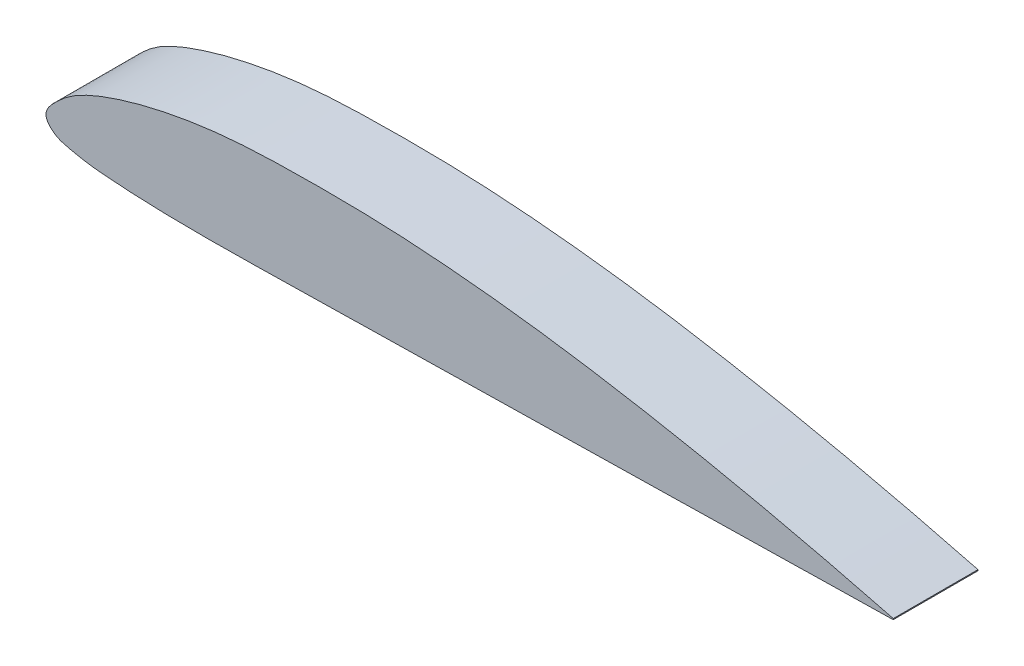
ISO-10303-21;
HEADER;
FILE_DESCRIPTION(('STEP AP214'),'2;1');
FILE_NAME('part.step','',(''),(''),'','','');
FILE_SCHEMA(('AUTOMOTIVE_DESIGN { 1 0 10303 214 1 1 1 1 }'));
ENDSEC;
DATA;
#1=APPLICATION_CONTEXT('core data for automotive mechanical design processes');
#2=APPLICATION_PROTOCOL_DEFINITION('international standard','automotive_design',2000,#1);
#3=PRODUCT_CONTEXT('',#1,'mechanical');
#4=PRODUCT('Part','Part','',(#3));
#5=PRODUCT_RELATED_PRODUCT_CATEGORY('part','',(#4));
#6=PRODUCT_DEFINITION_FORMATION('','',#4);
#7=PRODUCT_DEFINITION_CONTEXT('part definition',#1,'design');
#8=PRODUCT_DEFINITION('design','',#6,#7);
#9=PRODUCT_DEFINITION_SHAPE('','',#8);
#10=(LENGTH_UNIT() NAMED_UNIT(*) SI_UNIT(.MILLI.,.METRE.));
#11=(NAMED_UNIT(*) PLANE_ANGLE_UNIT() SI_UNIT($,.RADIAN.));
#12=(NAMED_UNIT(*) SI_UNIT($,.STERADIAN.) SOLID_ANGLE_UNIT());
#13=UNCERTAINTY_MEASURE_WITH_UNIT(LENGTH_MEASURE(1.E-05),#10,'distance_accuracy_value','');
#14=(GEOMETRIC_REPRESENTATION_CONTEXT(3) GLOBAL_UNCERTAINTY_ASSIGNED_CONTEXT((#13)) GLOBAL_UNIT_ASSIGNED_CONTEXT((#10,
#11,#12)) REPRESENTATION_CONTEXT('',''));
#15=CARTESIAN_POINT('',(0.,0.,0.));
#16=DIRECTION('',(0.,0.,1.));
#17=DIRECTION('',(1.,0.,0.));
#18=AXIS2_PLACEMENT_3D('',#15,#16,#17);
#19=CARTESIAN_POINT('',(36.0244116229008,8.83389162209838,2.54));
#20=CARTESIAN_POINT('',(35.9401103880112,8.85544135572493,2.54));
#21=CARTESIAN_POINT('',(35.7715192547382,8.89853792505262,2.54));
#22=CARTESIAN_POINT('',(35.518615006872,8.96301180523324,2.54));
#23=CARTESIAN_POINT('',(35.265722853527,9.02726621860555,2.54));
#24=CARTESIAN_POINT('',(34.9285911205995,9.11227201238616,2.54));
#25=CARTESIAN_POINT('',(34.5071720053478,9.21707830359588,2.54));
#26=CARTESIAN_POINT('',(34.0012212999093,9.33999750117864,2.54));
#27=CARTESIAN_POINT('',(33.495215113899,9.46021481063174,2.54));
#28=CARTESIAN_POINT('',(32.9891990580677,9.57798313604354,2.54));
#29=CARTESIAN_POINT('',(32.4831313298856,9.69313577451666,2.54));
#30=CARTESIAN_POINT('',(31.9770268692627,9.80565387508404,2.54));
#31=CARTESIAN_POINT('',(31.4708528284104,9.91532430479675,2.54));
#32=CARTESIAN_POINT('',(30.9646538021946,10.0222690879351,2.54));
#33=CARTESIAN_POINT('',(30.4583759880928,10.1261934680355,2.54));
#34=CARTESIAN_POINT('',(29.9520678768009,10.227262376128,2.54));
#35=CARTESIAN_POINT('',(29.445684760486,10.3252438014009,2.54));
#36=CARTESIAN_POINT('',(28.9392672339054,10.4203069636247,2.54));
#37=CARTESIAN_POINT('',(28.4327892507069,10.5122948482318,2.54));
#38=CARTESIAN_POINT('',(27.9262702264024,10.6012165317799,2.54));
#39=CARTESIAN_POINT('',(27.4197056165849,10.6868790369494,2.54));
#40=CARTESIAN_POINT('',(26.9130589301014,10.7688301993306,2.54));
#41=CARTESIAN_POINT('',(26.4063560544678,10.8469530575221,2.54));
#42=CARTESIAN_POINT('',(25.8995614646011,10.9207869329597,2.54));
#43=CARTESIAN_POINT('',(25.2240549737191,11.0132504332984,2.54));
#44=CARTESIAN_POINT('',(24.5480141453919,11.0966445839144,2.54));
#45=CARTESIAN_POINT('',(23.8715459592572,11.1709083694092,2.54));
#46=CARTESIAN_POINT('',(23.3643430876918,11.2220189284426,2.54));
#47=CARTESIAN_POINT('',(22.8570658538505,11.2685217552309,2.54));
#48=CARTESIAN_POINT('',(22.1807821024889,11.3239820158418,2.54));
#49=CARTESIAN_POINT('',(21.5040554671134,11.3687237650845,2.54));
#50=CARTESIAN_POINT('',(20.8269796291316,11.4011454832613,2.54));
#51=CARTESIAN_POINT('',(20.3191679010904,11.4188321498629,2.54));
#52=CARTESIAN_POINT('',(19.8112546343039,11.4303145037513,2.54));
#53=CARTESIAN_POINT('',(19.3032501941174,11.4360515627545,2.54));
#54=CARTESIAN_POINT('',(18.7951631818029,11.4366841932682,2.54));
#55=CARTESIAN_POINT('',(18.2870012331172,11.4325442362608,2.54));
#56=CARTESIAN_POINT('',(17.778727324565,11.4245596873459,2.54));
#57=CARTESIAN_POINT('',(17.2702969651732,11.4105092351683,2.54));
#58=CARTESIAN_POINT('',(16.7616525002768,11.38797297823,2.54));
#59=CARTESIAN_POINT('',(16.2527374575186,11.3543481285077,2.54));
#60=CARTESIAN_POINT('',(15.7434861326676,11.3071832299665,2.54));
#61=CARTESIAN_POINT('',(15.2340224622295,11.2435995242716,2.54));
#62=CARTESIAN_POINT('',(14.7243423357386,11.163441883017,2.54));
#63=CARTESIAN_POINT('',(14.2142430503494,11.0673449348983,2.54));
#64=CARTESIAN_POINT('',(13.7035353889346,10.954250255143,2.54));
#65=CARTESIAN_POINT('',(13.1922195491395,10.8207133030235,2.54));
#66=CARTESIAN_POINT('',(12.6805448892658,10.6623372005084,2.54));
#67=CARTESIAN_POINT('',(12.254293529233,10.5099508609272,2.54));
#68=CARTESIAN_POINT('',(11.9141780112103,10.3655240801579,2.54));
#69=CARTESIAN_POINT('',(11.6561311894015,10.2390552515866,2.54));
#70=CARTESIAN_POINT('',(11.3953528397534,10.0879907717887,2.54));
#71=CARTESIAN_POINT('',(11.1539460257398,9.91061546354276,2.54));
#72=CARTESIAN_POINT('',(10.9720219426564,9.74146138689633,2.54));
#73=CARTESIAN_POINT('',(10.8330332124092,9.60537746654981,2.54));
#74=CARTESIAN_POINT('',(10.7445376455335,9.50566108582094,2.54));
#75=CARTESIAN_POINT('',(10.6859853648473,9.41953364628471,2.54));
#76=CARTESIAN_POINT('',(10.6570923509584,9.36294809061483,2.54));
#77=CARTESIAN_POINT('',(10.6384138153028,9.31408884330308,2.54));
#78=CARTESIAN_POINT('',(10.6210420494952,9.24332733901724,2.54));
#79=CARTESIAN_POINT('',(10.6279573030614,9.16925767775213,2.54));
#80=CARTESIAN_POINT('',(10.6525587370296,9.10445971673368,2.54));
#81=CARTESIAN_POINT('',(10.6793031516612,9.05280607795355,2.54));
#82=CARTESIAN_POINT('',(10.7341260264743,8.97723066134646,2.54));
#83=CARTESIAN_POINT('',(10.8183282952831,8.89667826673253,2.54));
#84=CARTESIAN_POINT('',(10.9502329427269,8.80400166544255,2.54));
#85=CARTESIAN_POINT('',(11.138372059504,8.72751354050775,2.54));
#86=CARTESIAN_POINT('',(11.3791531730066,8.67461308456474,2.54));
#87=CARTESIAN_POINT('',(11.6320536854982,8.61971887990225,2.54));
#88=CARTESIAN_POINT('',(11.8855210763617,8.57649699943447,2.54));
#89=CARTESIAN_POINT('',(12.2235502806181,8.53467734057742,2.54));
#90=CARTESIAN_POINT('',(12.6468620584357,8.50292972580234,2.54));
#91=CARTESIAN_POINT('',(13.1543995885915,8.46993345903285,2.54));
#92=CARTESIAN_POINT('',(13.662167573359,8.44656358856411,2.54));
#93=CARTESIAN_POINT('',(14.1700243566949,8.43082011750246,2.54));
#94=CARTESIAN_POINT('',(14.6779821990608,8.42174442539335,2.54));
#95=CARTESIAN_POINT('',(15.1860186256667,8.41830510571906,2.54));
#96=CARTESIAN_POINT('',(15.8635380028525,8.41967575660222,2.54));
#97=CARTESIAN_POINT('',(16.5411068976195,8.42798348666894,2.54));
#98=CARTESIAN_POINT('',(17.2186952368535,8.44011473495321,2.54));
#99=CARTESIAN_POINT('',(17.7269381583901,8.45030349452697,2.54));
#100=CARTESIAN_POINT('',(18.2351874296081,8.46092623984198,2.54));
#101=CARTESIAN_POINT('',(18.7434422150139,8.47116130068692,2.54));
#102=CARTESIAN_POINT('',(19.2516951707655,8.48099044831205,2.54));
#103=CARTESIAN_POINT('',(19.7599423117282,8.49069824096843,2.54));
#104=CARTESIAN_POINT('',(20.2681893646366,8.5002305878808,2.54));
#105=CARTESIAN_POINT('',(20.7764349500581,8.50982429031724,2.54));
#106=CARTESIAN_POINT('',(21.2846811378214,8.51950024136772,2.54));
#107=CARTESIAN_POINT('',(21.7929288388174,8.52924286913881,2.54));
#108=CARTESIAN_POINT('',(22.301176314642,8.53909364228895,2.54));
#109=CARTESIAN_POINT('',(22.8094258500054,8.54890218413859,2.54));
#110=CARTESIAN_POINT('',(23.3176742067309,8.55877163737149,2.54));
#111=CARTESIAN_POINT('',(23.8259232033712,8.56859196270717,2.54));
#112=CARTESIAN_POINT('',(24.334171588868,8.57839557797308,2.54));
#113=CARTESIAN_POINT('',(25.1812521552734,8.59467428180392,2.54));
#114=CARTESIAN_POINT('',(26.0283318895856,8.61098006099189,2.54));
#115=CARTESIAN_POINT('',(27.0448288447809,8.63051311381692,2.54));
#116=CARTESIAN_POINT('',(27.7224919942926,8.64362313909416,2.54));
#117=CARTESIAN_POINT('',(28.4001574799229,8.65662799377411,2.54));
#118=CARTESIAN_POINT('',(28.9084048389626,8.66645260420005,2.54));
#119=CARTESIAN_POINT('',(29.4166539482277,8.67620246805011,2.54));
#120=CARTESIAN_POINT('',(29.9249012877847,8.68602809016648,2.54));
#121=CARTESIAN_POINT('',(30.4331504022704,8.69577768292732,2.54));
#122=CARTESIAN_POINT('',(30.941397740428,8.70560337771099,2.54));
#123=CARTESIAN_POINT('',(31.4496468552907,8.71535295089204,2.54));
#124=CARTESIAN_POINT('',(31.9578941933394,8.72517865132761,2.54));
#125=CARTESIAN_POINT('',(32.4661433082605,8.73492822148093,2.54));
#126=CARTESIAN_POINT('',(32.9743906461848,8.74475392837555,2.54));
#127=CARTESIAN_POINT('',(33.4826397615452,8.75450347572038,2.54));
#128=CARTESIAN_POINT('',(33.9908870978363,8.76432926738997,2.54));
#129=CARTESIAN_POINT('',(34.4991362192905,8.77407849844366,2.54));
#130=CARTESIAN_POINT('',(34.9226756990267,8.78226764282826,2.54));
#131=CARTESIAN_POINT('',(35.2615081360034,8.78877788339691,2.54));
#132=CARTESIAN_POINT('',(35.5156320723571,8.79366877968042,2.54));
#133=CARTESIAN_POINT('',(35.7697565575686,8.79854733862278,2.54));
#134=CARTESIAN_POINT('',(35.9391724556521,8.80182714861004,2.54));
#135=CARTESIAN_POINT('',(36.0238805601348,8.80346705661293,2.54));
#136=B_SPLINE_CURVE_WITH_KNOTS('',3,(#19,#20,#21,#22,#23,#24,#25,#26,#27,#28,#29,#30,#31,#32,
#33,#34,#35,#36,#37,#38,#39,#40,#41,#42,#43,#44,#45,#46,#47,#48,#49,#50,#51,#52,#53,#54,#55,#56,
#57,#58,#59,#60,#61,#62,#63,#64,#65,#66,#67,#68,#69,#70,#71,#72,#73,#74,#75,#76,#77,#78,#79,#80,
#81,#82,#83,#84,#85,#86,#87,#88,#89,#90,#91,#92,#93,#94,#95,#96,#97,#98,#99,#100,#101,#102,#103,
#104,#105,#106,#107,#108,#109,#110,#111,#112,#113,#114,#115,#116,#117,#118,#119,#120,#121,#122,
#123,#124,#125,#126,#127,#128,#129,#130,#131,#132,#133,#134,#135),.UNSPECIFIED.,.F.,.F.,(4,1,1,
1,1,1,1,1,1,1,1,1,1,1,1,1,1,1,1,1,1,1,1,1,1,1,1,1,1,1,1,1,1,1,1,1,1,1,1,1,1,1,1,1,1,1,1,1,1,1,1,
1,1,1,1,1,1,1,1,1,1,1,1,1,1,1,1,1,1,1,1,1,1,1,1,1,1,1,1,1,1,1,1,1,1,1,1,1,1,1,1,1,1,1,1,1,1,1,1,
1,1,1,1,1,1,1,1,1,1,1,1,1,1,1,4),(0.,0.00502783507920512,0.0100549940344635,0.0150810297240759,
0.0201050549080901,0.0301452607809433,0.0401736458927437,0.0501907944797705,0.0601976798950131,
0.0701942255550733,0.080180376641249,0.0901559102827993,0.100121105793046,0.110075702815163,
0.120020101260909,0.12995427083149,0.139878706126609,0.149793490904473,0.159698811392376,
0.169594433213407,0.179479778460019,0.189354743837752,0.199219015443769,0.209072795450207,
0.228751158154273,0.238577241843568,0.248395636485294,0.258207018047657,0.268011852233636,
0.28760402315173,0.297393126728297,0.30717925271197,0.316964017963334,0.326748818989175,
0.336534714870927,0.346322473718417,0.356112722227348,0.365907651807351,0.375711463271154,
0.385530878969925,0.395375762487733,0.405259304622106,0.415192461064141,0.425184025337781,
0.435248335040234,0.445412190892236,0.455710778825161,0.466190958855658,0.471552192168147,
0.477054503678275,0.482786726573929,0.488945835105149,0.494316032866102,0.497126416153154,
0.500187367762256,0.50200086881537,0.50312820232303,0.503849971017213,0.505020136520667,
0.507317904862695,0.507986558007653,0.509023585585765,0.510668218535328,0.513358347504693,
0.515715811851598,0.519949385272463,0.524973187970153,0.529954400275476,0.534903201933464,
0.539824122915189,0.549630394385821,0.559425368878799,0.569214167199772,0.578999733437889,
0.588784364017045,0.598569510856094,0.608355932640458,0.627933314763684,0.637723968115274,
0.647515400204077,0.657307127187741,0.667098669129828,0.676889956114584,0.68668111741491,
0.69647218967302,0.706263279690747,0.716054423133804,0.725845620221906,0.735636871174764,
0.745428122127622,0.755219391084224,0.765010642037082,0.774801875010609,0.784593090029218,
0.813966735085043,0.823757950103652,0.843340416050707,0.853131631069315,0.862922864042843,
0.872714079061451,0.882505312034979,0.892296527053587,0.902087760027115,0.911878975045723,
0.92167020801925,0.931461423037859,0.941252656011386,0.951043871029995,0.960835104003522,
0.970626319022131,0.980417551995658,0.985313159504962,0.990208767014267,0.995104374523571,1.),.UNSPECIFIED.);
#137=DIRECTION('',(0.,0.,-1.));
#138=VECTOR('',#137,1.);
#139=SURFACE_OF_LINEAR_EXTRUSION('',#136,#138);
#140=CARTESIAN_POINT('',(36.0244116229008,8.83389162209838,0.));
#141=CARTESIAN_POINT('',(35.9401103880112,8.85544135572493,0.));
#142=CARTESIAN_POINT('',(35.7715192547382,8.89853792505262,0.));
#143=CARTESIAN_POINT('',(35.518615006872,8.96301180523324,0.));
#144=CARTESIAN_POINT('',(35.265722853527,9.02726621860555,0.));
#145=CARTESIAN_POINT('',(34.9285911205995,9.11227201238616,0.));
#146=CARTESIAN_POINT('',(34.5071720053478,9.21707830359588,0.));
#147=CARTESIAN_POINT('',(34.0012212999093,9.33999750117864,0.));
#148=CARTESIAN_POINT('',(33.495215113899,9.46021481063174,0.));
#149=CARTESIAN_POINT('',(32.9891990580677,9.57798313604354,0.));
#150=CARTESIAN_POINT('',(32.4831313298856,9.69313577451666,0.));
#151=CARTESIAN_POINT('',(31.9770268692627,9.80565387508404,0.));
#152=CARTESIAN_POINT('',(31.4708528284104,9.91532430479675,0.));
#153=CARTESIAN_POINT('',(30.9646538021946,10.0222690879351,0.));
#154=CARTESIAN_POINT('',(30.4583759880928,10.1261934680355,0.));
#155=CARTESIAN_POINT('',(29.9520678768009,10.227262376128,0.));
#156=CARTESIAN_POINT('',(29.445684760486,10.3252438014009,0.));
#157=CARTESIAN_POINT('',(28.9392672339054,10.4203069636247,0.));
#158=CARTESIAN_POINT('',(28.4327892507069,10.5122948482318,0.));
#159=CARTESIAN_POINT('',(27.9262702264024,10.6012165317799,0.));
#160=CARTESIAN_POINT('',(27.4197056165849,10.6868790369494,0.));
#161=CARTESIAN_POINT('',(26.9130589301014,10.7688301993306,0.));
#162=CARTESIAN_POINT('',(26.4063560544678,10.8469530575221,0.));
#163=CARTESIAN_POINT('',(25.8995614646011,10.9207869329597,0.));
#164=CARTESIAN_POINT('',(25.2240549737191,11.0132504332984,0.));
#165=CARTESIAN_POINT('',(24.5480141453919,11.0966445839144,0.));
#166=CARTESIAN_POINT('',(23.8715459592572,11.1709083694092,0.));
#167=CARTESIAN_POINT('',(23.3643430876918,11.2220189284426,0.));
#168=CARTESIAN_POINT('',(22.8570658538505,11.2685217552309,0.));
#169=CARTESIAN_POINT('',(22.1807821024889,11.3239820158418,0.));
#170=CARTESIAN_POINT('',(21.5040554671134,11.3687237650845,0.));
#171=CARTESIAN_POINT('',(20.8269796291316,11.4011454832613,0.));
#172=CARTESIAN_POINT('',(20.3191679010904,11.4188321498629,0.));
#173=CARTESIAN_POINT('',(19.8112546343039,11.4303145037513,0.));
#174=CARTESIAN_POINT('',(19.3032501941174,11.4360515627545,0.));
#175=CARTESIAN_POINT('',(18.7951631818029,11.4366841932682,0.));
#176=CARTESIAN_POINT('',(18.2870012331172,11.4325442362608,0.));
#177=CARTESIAN_POINT('',(17.778727324565,11.4245596873459,0.));
#178=CARTESIAN_POINT('',(17.2702969651732,11.4105092351683,0.));
#179=CARTESIAN_POINT('',(16.7616525002768,11.38797297823,0.));
#180=CARTESIAN_POINT('',(16.2527374575186,11.3543481285077,0.));
#181=CARTESIAN_POINT('',(15.7434861326676,11.3071832299665,0.));
#182=CARTESIAN_POINT('',(15.2340224622295,11.2435995242716,0.));
#183=CARTESIAN_POINT('',(14.7243423357386,11.163441883017,0.));
#184=CARTESIAN_POINT('',(14.2142430503494,11.0673449348983,0.));
#185=CARTESIAN_POINT('',(13.7035353889346,10.954250255143,0.));
#186=CARTESIAN_POINT('',(13.1922195491395,10.8207133030235,0.));
#187=CARTESIAN_POINT('',(12.6805448892658,10.6623372005084,0.));
#188=CARTESIAN_POINT('',(12.254293529233,10.5099508609272,0.));
#189=CARTESIAN_POINT('',(11.9141780112103,10.3655240801579,0.));
#190=CARTESIAN_POINT('',(11.6561311894015,10.2390552515866,0.));
#191=CARTESIAN_POINT('',(11.3953528397534,10.0879907717887,0.));
#192=CARTESIAN_POINT('',(11.1539460257398,9.91061546354276,0.));
#193=CARTESIAN_POINT('',(10.9720219426564,9.74146138689633,0.));
#194=CARTESIAN_POINT('',(10.8330332124092,9.60537746654981,0.));
#195=CARTESIAN_POINT('',(10.7445376455335,9.50566108582094,0.));
#196=CARTESIAN_POINT('',(10.6859853648473,9.41953364628471,0.));
#197=CARTESIAN_POINT('',(10.6570923509584,9.36294809061483,0.));
#198=CARTESIAN_POINT('',(10.6384138153028,9.31408884330308,0.));
#199=CARTESIAN_POINT('',(10.6210420494952,9.24332733901724,0.));
#200=CARTESIAN_POINT('',(10.6279573030614,9.16925767775213,0.));
#201=CARTESIAN_POINT('',(10.6525587370296,9.10445971673368,0.));
#202=CARTESIAN_POINT('',(10.6793031516612,9.05280607795355,0.));
#203=CARTESIAN_POINT('',(10.7341260264743,8.97723066134646,0.));
#204=CARTESIAN_POINT('',(10.8183282952831,8.89667826673253,0.));
#205=CARTESIAN_POINT('',(10.9502329427269,8.80400166544255,0.));
#206=CARTESIAN_POINT('',(11.138372059504,8.72751354050775,0.));
#207=CARTESIAN_POINT('',(11.3791531730066,8.67461308456474,0.));
#208=CARTESIAN_POINT('',(11.6320536854982,8.61971887990225,0.));
#209=CARTESIAN_POINT('',(11.8855210763617,8.57649699943447,0.));
#210=CARTESIAN_POINT('',(12.2235502806181,8.53467734057742,0.));
#211=CARTESIAN_POINT('',(12.6468620584357,8.50292972580234,0.));
#212=CARTESIAN_POINT('',(13.1543995885915,8.46993345903285,0.));
#213=CARTESIAN_POINT('',(13.662167573359,8.44656358856411,0.));
#214=CARTESIAN_POINT('',(14.1700243566949,8.43082011750246,0.));
#215=CARTESIAN_POINT('',(14.6779821990608,8.42174442539335,0.));
#216=CARTESIAN_POINT('',(15.1860186256667,8.41830510571906,0.));
#217=CARTESIAN_POINT('',(15.8635380028525,8.41967575660222,0.));
#218=CARTESIAN_POINT('',(16.5411068976195,8.42798348666894,0.));
#219=CARTESIAN_POINT('',(17.2186952368535,8.44011473495321,0.));
#220=CARTESIAN_POINT('',(17.7269381583901,8.45030349452697,0.));
#221=CARTESIAN_POINT('',(18.2351874296081,8.46092623984198,0.));
#222=CARTESIAN_POINT('',(18.7434422150139,8.47116130068692,0.));
#223=CARTESIAN_POINT('',(19.2516951707655,8.48099044831205,0.));
#224=CARTESIAN_POINT('',(19.7599423117282,8.49069824096843,0.));
#225=CARTESIAN_POINT('',(20.2681893646366,8.5002305878808,0.));
#226=CARTESIAN_POINT('',(20.7764349500581,8.50982429031724,0.));
#227=CARTESIAN_POINT('',(21.2846811378214,8.51950024136772,0.));
#228=CARTESIAN_POINT('',(21.7929288388174,8.52924286913881,0.));
#229=CARTESIAN_POINT('',(22.301176314642,8.53909364228895,0.));
#230=CARTESIAN_POINT('',(22.8094258500054,8.54890218413859,0.));
#231=CARTESIAN_POINT('',(23.3176742067309,8.55877163737149,0.));
#232=CARTESIAN_POINT('',(23.8259232033712,8.56859196270717,0.));
#233=CARTESIAN_POINT('',(24.334171588868,8.57839557797308,0.));
#234=CARTESIAN_POINT('',(25.1812521552734,8.59467428180392,0.));
#235=CARTESIAN_POINT('',(26.0283318895856,8.61098006099189,0.));
#236=CARTESIAN_POINT('',(27.0448288447809,8.63051311381692,0.));
#237=CARTESIAN_POINT('',(27.7224919942926,8.64362313909416,0.));
#238=CARTESIAN_POINT('',(28.4001574799229,8.65662799377411,0.));
#239=CARTESIAN_POINT('',(28.9084048389626,8.66645260420005,0.));
#240=CARTESIAN_POINT('',(29.4166539482277,8.67620246805011,0.));
#241=CARTESIAN_POINT('',(29.9249012877847,8.68602809016648,0.));
#242=CARTESIAN_POINT('',(30.4331504022704,8.69577768292732,0.));
#243=CARTESIAN_POINT('',(30.941397740428,8.70560337771099,0.));
#244=CARTESIAN_POINT('',(31.4496468552907,8.71535295089204,0.));
#245=CARTESIAN_POINT('',(31.9578941933394,8.72517865132761,0.));
#246=CARTESIAN_POINT('',(32.4661433082605,8.73492822148093,0.));
#247=CARTESIAN_POINT('',(32.9743906461848,8.74475392837555,0.));
#248=CARTESIAN_POINT('',(33.4826397615452,8.75450347572038,0.));
#249=CARTESIAN_POINT('',(33.9908870978363,8.76432926738997,0.));
#250=CARTESIAN_POINT('',(34.4991362192905,8.77407849844366,0.));
#251=CARTESIAN_POINT('',(34.9226756990267,8.78226764282826,0.));
#252=CARTESIAN_POINT('',(35.2615081360034,8.78877788339691,0.));
#253=CARTESIAN_POINT('',(35.5156320723571,8.79366877968042,0.));
#254=CARTESIAN_POINT('',(35.7697565575686,8.79854733862278,0.));
#255=CARTESIAN_POINT('',(35.9391724556521,8.80182714861004,0.));
#256=CARTESIAN_POINT('',(36.0238805601348,8.80346705661293,0.));
#257=B_SPLINE_CURVE_WITH_KNOTS('',3,(#140,#141,#142,#143,#144,#145,#146,#147,#148,#149,#150,
#151,#152,#153,#154,#155,#156,#157,#158,#159,#160,#161,#162,#163,#164,#165,#166,#167,#168,#169,
#170,#171,#172,#173,#174,#175,#176,#177,#178,#179,#180,#181,#182,#183,#184,#185,#186,#187,#188,
#189,#190,#191,#192,#193,#194,#195,#196,#197,#198,#199,#200,#201,#202,#203,#204,#205,#206,#207,
#208,#209,#210,#211,#212,#213,#214,#215,#216,#217,#218,#219,#220,#221,#222,#223,#224,#225,#226,
#227,#228,#229,#230,#231,#232,#233,#234,#235,#236,#237,#238,#239,#240,#241,#242,#243,#244,#245,
#246,#247,#248,#249,#250,#251,#252,#253,#254,#255,#256),.UNSPECIFIED.,.F.,.F.,(4,1,1,1,1,1,1,1,
1,1,1,1,1,1,1,1,1,1,1,1,1,1,1,1,1,1,1,1,1,1,1,1,1,1,1,1,1,1,1,1,1,1,1,1,1,1,1,1,1,1,1,1,1,1,1,1,
1,1,1,1,1,1,1,1,1,1,1,1,1,1,1,1,1,1,1,1,1,1,1,1,1,1,1,1,1,1,1,1,1,1,1,1,1,1,1,1,1,1,1,1,1,1,1,1,
1,1,1,1,1,1,1,1,1,1,4),(0.,0.00502783507920512,0.0100549940344635,0.0150810297240759,
0.0201050549080901,0.0301452607809433,0.0401736458927437,0.0501907944797705,0.0601976798950131,
0.0701942255550733,0.080180376641249,0.0901559102827993,0.100121105793046,0.110075702815163,
0.120020101260909,0.12995427083149,0.139878706126609,0.149793490904473,0.159698811392376,
0.169594433213407,0.179479778460019,0.189354743837752,0.199219015443769,0.209072795450207,
0.228751158154273,0.238577241843568,0.248395636485294,0.258207018047657,0.268011852233636,
0.28760402315173,0.297393126728297,0.30717925271197,0.316964017963334,0.326748818989175,
0.336534714870927,0.346322473718417,0.356112722227348,0.365907651807351,0.375711463271154,
0.385530878969925,0.395375762487733,0.405259304622106,0.415192461064141,0.425184025337781,
0.435248335040234,0.445412190892236,0.455710778825161,0.466190958855658,0.471552192168147,
0.477054503678275,0.482786726573929,0.488945835105149,0.494316032866102,0.497126416153154,
0.500187367762256,0.50200086881537,0.50312820232303,0.503849971017213,0.505020136520667,
0.507317904862695,0.507986558007653,0.509023585585765,0.510668218535328,0.513358347504693,
0.515715811851598,0.519949385272463,0.524973187970153,0.529954400275476,0.534903201933464,
0.539824122915189,0.549630394385821,0.559425368878799,0.569214167199772,0.578999733437889,
0.588784364017045,0.598569510856094,0.608355932640458,0.627933314763684,0.637723968115274,
0.647515400204077,0.657307127187741,0.667098669129828,0.676889956114584,0.68668111741491,
0.69647218967302,0.706263279690747,0.716054423133804,0.725845620221906,0.735636871174764,
0.745428122127622,0.755219391084224,0.765010642037082,0.774801875010609,0.784593090029218,
0.813966735085043,0.823757950103652,0.843340416050707,0.853131631069315,0.862922864042843,
0.872714079061451,0.882505312034979,0.892296527053587,0.902087760027115,0.911878975045723,
0.92167020801925,0.931461423037859,0.941252656011386,0.951043871029995,0.960835104003522,
0.970626319022131,0.980417551995658,0.985313159504962,0.990208767014267,0.995104374523571,1.),.UNSPECIFIED.);
#258=CARTESIAN_POINT('',(36.0244116229008,8.83389162209838,0.));
#259=VERTEX_POINT('',#258);
#260=CARTESIAN_POINT('',(36.0238805601348,8.80346705661293,0.));
#261=VERTEX_POINT('',#260);
#262=EDGE_CURVE('E71',#259,#261,#257,.T.);
#263=ORIENTED_EDGE('',*,*,#262,.T.);
#264=DIRECTION('',(0.,0.,-1.));
#265=VECTOR('',#264,1.);
#266=CARTESIAN_POINT('',(36.0238805601348,8.80346705661293,2.54));
#267=LINE('',#266,#265);
#268=CARTESIAN_POINT('',(36.0238805601348,8.80346705661293,2.54));
#269=VERTEX_POINT('',#268);
#270=EDGE_CURVE('E11',#269,#261,#267,.T.);
#271=ORIENTED_EDGE('',*,*,#270,.F.);
#272=CARTESIAN_POINT('',(36.0244116229008,8.83389162209838,2.54));
#273=VERTEX_POINT('',#272);
#274=EDGE_CURVE('E70',#273,#269,#136,.T.);
#275=ORIENTED_EDGE('',*,*,#274,.F.);
#276=DIRECTION('',(0.,0.,-1.));
#277=VECTOR('',#276,1.);
#278=CARTESIAN_POINT('',(36.0244116229008,8.83389162209838,2.54));
#279=LINE('',#278,#277);
#280=EDGE_CURVE('E48',#273,#259,#279,.T.);
#281=ORIENTED_EDGE('',*,*,#280,.T.);
#282=EDGE_LOOP('',(#263,#271,#275,#281));
#283=FACE_BOUND('',#282,.T.);
#284=ADVANCED_FACE('F39',(#283),#139,.F.);
#285=CARTESIAN_POINT('',(36.0244116229008,8.83389162209838,2.54));
#286=DIRECTION('',(-0.999847695156394,0.0174524064371455,0.));
#287=DIRECTION('',(-0.0174524064371455,-0.999847695156394,0.));
#288=AXIS2_PLACEMENT_3D('',#285,#286,#287);
#289=PLANE('',#288);
#290=DIRECTION('',(0.0174524064371455,0.999847695156394,0.));
#291=VECTOR('',#290,1.);
#292=CARTESIAN_POINT('',(36.0244116229008,8.83389162209838,0.));
#293=LINE('',#292,#291);
#294=EDGE_CURVE('E63',#261,#259,#293,.T.);
#295=ORIENTED_EDGE('',*,*,#294,.T.);
#296=ORIENTED_EDGE('',*,*,#280,.F.);
#297=DIRECTION('',(0.0174524064371455,0.999847695156394,0.));
#298=VECTOR('',#297,1.);
#299=CARTESIAN_POINT('',(36.0244116229008,8.83389162209838,2.54));
#300=LINE('',#299,#298);
#301=EDGE_CURVE('E55',#269,#273,#300,.T.);
#302=ORIENTED_EDGE('',*,*,#301,.F.);
#303=ORIENTED_EDGE('',*,*,#270,.T.);
#304=EDGE_LOOP('',(#295,#296,#302,#303));
#305=FACE_BOUND('',#304,.T.);
#306=ADVANCED_FACE('F66',(#305),#289,.F.);
#307=CARTESIAN_POINT('',(10.7394444405493,9.4945818568429,2.54));
#308=DIRECTION('',(0.,0.,-1.));
#309=DIRECTION('',(-1.,0.,0.));
#310=AXIS2_PLACEMENT_3D('',#307,#308,#309);
#311=PLANE('',#310);
#312=ORIENTED_EDGE('',*,*,#274,.T.);
#313=ORIENTED_EDGE('',*,*,#301,.T.);
#314=EDGE_LOOP('',(#312,#313));
#315=FACE_BOUND('',#314,.T.);
#316=ADVANCED_FACE('F88',(#315),#311,.F.);
#317=CARTESIAN_POINT('',(10.7394444405493,9.4945818568429,0.));
#318=DIRECTION('',(0.,0.,-1.));
#319=DIRECTION('',(-1.,0.,0.));
#320=AXIS2_PLACEMENT_3D('',#317,#318,#319);
#321=PLANE('',#320);
#322=ORIENTED_EDGE('',*,*,#262,.F.);
#323=ORIENTED_EDGE('',*,*,#294,.F.);
#324=EDGE_LOOP('',(#322,#323));
#325=FACE_BOUND('',#324,.T.);
#326=ADVANCED_FACE('F74',(#325),#321,.T.);
#327=CLOSED_SHELL('',(#284,#306,#316,#326));
#328=MANIFOLD_SOLID_BREP('B2',#327);
#329=ADVANCED_BREP_SHAPE_REPRESENTATION('',(#18,#328),#14);
#330=SHAPE_DEFINITION_REPRESENTATION(#9,#329);
ENDSEC;
END-ISO-10303-21;
